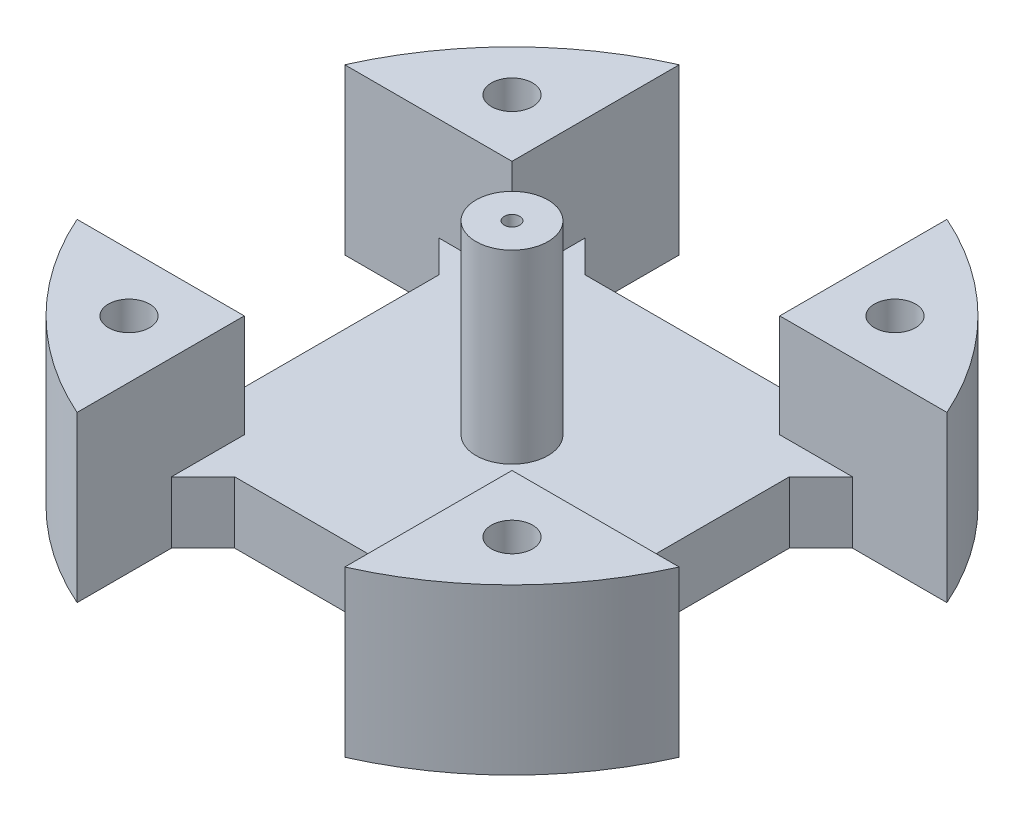
ISO-10303-21;
HEADER;
FILE_DESCRIPTION(('STEP AP214'),'2;1');
FILE_NAME('part.step','',(''),(''),'','','');
FILE_SCHEMA(('AUTOMOTIVE_DESIGN { 1 0 10303 214 1 1 1 1 }'));
ENDSEC;
DATA;
#1=APPLICATION_CONTEXT('core data for automotive mechanical design processes');
#2=APPLICATION_PROTOCOL_DEFINITION('international standard','automotive_design',2000,#1);
#3=PRODUCT_CONTEXT('',#1,'mechanical');
#4=PRODUCT('Part','Part','',(#3));
#5=PRODUCT_RELATED_PRODUCT_CATEGORY('part','',(#4));
#6=PRODUCT_DEFINITION_FORMATION('','',#4);
#7=PRODUCT_DEFINITION_CONTEXT('part definition',#1,'design');
#8=PRODUCT_DEFINITION('design','',#6,#7);
#9=PRODUCT_DEFINITION_SHAPE('','',#8);
#10=(LENGTH_UNIT() NAMED_UNIT(*) SI_UNIT(.MILLI.,.METRE.));
#11=(NAMED_UNIT(*) PLANE_ANGLE_UNIT() SI_UNIT($,.RADIAN.));
#12=(NAMED_UNIT(*) SI_UNIT($,.STERADIAN.) SOLID_ANGLE_UNIT());
#13=UNCERTAINTY_MEASURE_WITH_UNIT(LENGTH_MEASURE(1.E-05),#10,'distance_accuracy_value','');
#14=(GEOMETRIC_REPRESENTATION_CONTEXT(3) GLOBAL_UNCERTAINTY_ASSIGNED_CONTEXT((#13)) GLOBAL_UNIT_ASSIGNED_CONTEXT((#10,
#11,#12)) REPRESENTATION_CONTEXT('',''));
#15=CARTESIAN_POINT('',(0.,0.,0.));
#16=DIRECTION('',(0.,0.,1.));
#17=DIRECTION('',(1.,0.,0.));
#18=AXIS2_PLACEMENT_3D('',#15,#16,#17);
#19=CARTESIAN_POINT('',(0.,3.,0.));
#20=DIRECTION('',(0.,1.,0.));
#21=DIRECTION('',(0.,0.,1.));
#22=AXIS2_PLACEMENT_3D('',#19,#20,#21);
#23=PLANE('',#22);
#24=DIRECTION('',(0.707106781186536,0.,0.707106781186559));
#25=VECTOR('',#24,1.);
#26=CARTESIAN_POINT('',(-1.76776695296641,3.,1.76776695296635));
#27=LINE('',#26,#25);
#28=CARTESIAN_POINT('',(4.96446609406703,3.,8.5));
#29=VERTEX_POINT('',#28);
#30=CARTESIAN_POINT('',(6.5,3.,10.035533905933));
#31=VERTEX_POINT('',#30);
#32=EDGE_CURVE('E234',#29,#31,#27,.T.);
#33=ORIENTED_EDGE('',*,*,#32,.T.);
#34=DIRECTION('',(0.,0.,1.));
#35=VECTOR('',#34,1.);
#36=CARTESIAN_POINT('',(6.5,3.,6.5));
#37=LINE('',#36,#35);
#38=CARTESIAN_POINT('',(6.5,3.,6.5));
#39=VERTEX_POINT('',#38);
#40=EDGE_CURVE('E228',#39,#31,#37,.T.);
#41=ORIENTED_EDGE('',*,*,#40,.F.);
#42=DIRECTION('',(-1.,0.,0.));
#43=VECTOR('',#42,1.);
#44=CARTESIAN_POINT('',(20.9643029327709,3.,6.5));
#45=LINE('',#44,#43);
#46=CARTESIAN_POINT('',(10.0355339059329,3.,6.5));
#47=VERTEX_POINT('',#46);
#48=EDGE_CURVE('E220',#47,#39,#45,.T.);
#49=ORIENTED_EDGE('',*,*,#48,.F.);
#50=DIRECTION('',(-0.707106781186552,0.,-0.707106781186543));
#51=VECTOR('',#50,1.);
#52=CARTESIAN_POINT('',(1.76776695296641,3.,-1.76776695296644));
#53=LINE('',#52,#51);
#54=CARTESIAN_POINT('',(8.5,3.,4.96446609406707));
#55=VERTEX_POINT('',#54);
#56=EDGE_CURVE('E256',#47,#55,#53,.T.);
#57=ORIENTED_EDGE('',*,*,#56,.T.);
#58=DIRECTION('',(0.,0.,-1.));
#59=VECTOR('',#58,1.);
#60=CARTESIAN_POINT('',(8.5,3.,0.));
#61=LINE('',#60,#59);
#62=CARTESIAN_POINT('',(8.5,3.,-4.96446609406749));
#63=VERTEX_POINT('',#62);
#64=EDGE_CURVE('E258',#55,#63,#61,.T.);
#65=ORIENTED_EDGE('',*,*,#64,.T.);
#66=DIRECTION('',(0.707106781186535,0.,-0.70710678118656));
#67=VECTOR('',#66,1.);
#68=CARTESIAN_POINT('',(1.76776695296641,3.,1.76776695296635));
#69=LINE('',#68,#67);
#70=CARTESIAN_POINT('',(10.0355339059325,3.,-6.5));
#71=VERTEX_POINT('',#70);
#72=EDGE_CURVE('E260',#63,#71,#69,.T.);
#73=ORIENTED_EDGE('',*,*,#72,.T.);
#74=DIRECTION('',(1.,0.,0.));
#75=VECTOR('',#74,1.);
#76=CARTESIAN_POINT('',(6.5,3.,-6.5));
#77=LINE('',#76,#75);
#78=CARTESIAN_POINT('',(6.5,3.,-6.5));
#79=VERTEX_POINT('',#78);
#80=EDGE_CURVE('E458',#79,#71,#77,.T.);
#81=ORIENTED_EDGE('',*,*,#80,.F.);
#82=DIRECTION('',(0.,0.,1.));
#83=VECTOR('',#82,1.);
#84=CARTESIAN_POINT('',(6.5,3.,-17.2962218079363));
#85=LINE('',#84,#83);
#86=CARTESIAN_POINT('',(6.49999999999999,3.,-10.0355339059328));
#87=VERTEX_POINT('',#86);
#88=EDGE_CURVE('E50',#87,#79,#85,.T.);
#89=ORIENTED_EDGE('',*,*,#88,.F.);
#90=DIRECTION('',(0.707106781186552,0.,-0.707106781186543));
#91=VECTOR('',#90,1.);
#92=CARTESIAN_POINT('',(-1.76776695296642,3.,-1.76776695296645));
#93=LINE('',#92,#91);
#94=CARTESIAN_POINT('',(4.96446609406722,3.,-8.50000000000001));
#95=VERTEX_POINT('',#94);
#96=EDGE_CURVE('E11',#95,#87,#93,.T.);
#97=ORIENTED_EDGE('',*,*,#96,.F.);
#98=DIRECTION('',(1.,0.,0.));
#99=VECTOR('',#98,1.);
#100=CARTESIAN_POINT('',(0.,3.,-8.50000000000001));
#101=LINE('',#100,#99);
#102=CARTESIAN_POINT('',(-4.96446609406726,3.,-8.50000000000001));
#103=VERTEX_POINT('',#102);
#104=EDGE_CURVE('E243',#103,#95,#101,.T.);
#105=ORIENTED_EDGE('',*,*,#104,.F.);
#106=DIRECTION('',(0.707106781186547,0.,0.707106781186548));
#107=VECTOR('',#106,1.);
#108=CARTESIAN_POINT('',(1.76776695296637,3.,-1.76776695296636));
#109=LINE('',#108,#107);
#110=CARTESIAN_POINT('',(-6.5,3.,-10.0355339059327));
#111=VERTEX_POINT('',#110);
#112=EDGE_CURVE('E247',#111,#103,#109,.T.);
#113=ORIENTED_EDGE('',*,*,#112,.F.);
#114=DIRECTION('',(0.,0.,-1.));
#115=VECTOR('',#114,1.);
#116=CARTESIAN_POINT('',(-6.5,3.,-6.5));
#117=LINE('',#116,#115);
#118=CARTESIAN_POINT('',(-6.5,3.,-6.5));
#119=VERTEX_POINT('',#118);
#120=EDGE_CURVE('E454',#119,#111,#117,.T.);
#121=ORIENTED_EDGE('',*,*,#120,.F.);
#122=DIRECTION('',(1.,0.,0.));
#123=VECTOR('',#122,1.);
#124=CARTESIAN_POINT('',(-19.320760019923,3.,-6.5));
#125=LINE('',#124,#123);
#126=CARTESIAN_POINT('',(-10.0355339059325,3.,-6.5));
#127=VERTEX_POINT('',#126);
#128=EDGE_CURVE('E452',#127,#119,#125,.T.);
#129=ORIENTED_EDGE('',*,*,#128,.F.);
#130=DIRECTION('',(-0.707106781186535,0.,-0.70710678118656));
#131=VECTOR('',#130,1.);
#132=CARTESIAN_POINT('',(-1.76776695296641,3.,1.76776695296635));
#133=LINE('',#132,#131);
#134=CARTESIAN_POINT('',(-8.5,3.,-4.96446609406749));
#135=VERTEX_POINT('',#134);
#136=EDGE_CURVE('E262',#135,#127,#133,.T.);
#137=ORIENTED_EDGE('',*,*,#136,.F.);
#138=DIRECTION('',(0.,0.,-1.));
#139=VECTOR('',#138,1.);
#140=CARTESIAN_POINT('',(-8.5,3.,0.));
#141=LINE('',#140,#139);
#142=CARTESIAN_POINT('',(-8.5,3.,4.96446609406707));
#143=VERTEX_POINT('',#142);
#144=EDGE_CURVE('E265',#143,#135,#141,.T.);
#145=ORIENTED_EDGE('',*,*,#144,.F.);
#146=DIRECTION('',(0.707106781186551,0.,-0.707106781186545));
#147=VECTOR('',#146,1.);
#148=CARTESIAN_POINT('',(-1.76776695296643,3.,-1.76776695296645));
#149=LINE('',#148,#147);
#150=CARTESIAN_POINT('',(-10.0355339059329,3.,6.5));
#151=VERTEX_POINT('',#150);
#152=EDGE_CURVE('E268',#151,#143,#149,.T.);
#153=ORIENTED_EDGE('',*,*,#152,.F.);
#154=DIRECTION('',(-1.,0.,0.));
#155=VECTOR('',#154,1.);
#156=CARTESIAN_POINT('',(-6.5,3.,6.5));
#157=LINE('',#156,#155);
#158=CARTESIAN_POINT('',(-6.5,3.,6.5));
#159=VERTEX_POINT('',#158);
#160=EDGE_CURVE('E449',#159,#151,#157,.T.);
#161=ORIENTED_EDGE('',*,*,#160,.F.);
#162=DIRECTION('',(0.,0.,-1.));
#163=VECTOR('',#162,1.);
#164=CARTESIAN_POINT('',(-6.5,3.,16.5994319382506));
#165=LINE('',#164,#163);
#166=CARTESIAN_POINT('',(-6.5,3.,10.0355339059328));
#167=VERTEX_POINT('',#166);
#168=EDGE_CURVE('E237',#167,#159,#165,.T.);
#169=ORIENTED_EDGE('',*,*,#168,.F.);
#170=DIRECTION('',(0.707106781186551,0.,-0.707106781186544));
#171=VECTOR('',#170,1.);
#172=CARTESIAN_POINT('',(1.76776695296642,3.,1.76776695296644));
#173=LINE('',#172,#171);
#174=CARTESIAN_POINT('',(-4.96446609406722,3.,8.5));
#175=VERTEX_POINT('',#174);
#176=EDGE_CURVE('E271',#167,#175,#173,.T.);
#177=ORIENTED_EDGE('',*,*,#176,.T.);
#178=DIRECTION('',(1.,0.,0.));
#179=VECTOR('',#178,1.);
#180=CARTESIAN_POINT('',(0.,3.,8.5));
#181=LINE('',#180,#179);
#182=EDGE_CURVE('E273',#175,#29,#181,.T.);
#183=ORIENTED_EDGE('',*,*,#182,.T.);
#184=EDGE_LOOP('',(#33,#41,#49,#57,#65,#73,#81,#89,#97,#105,#113,#121,#129,#137,#145,#153,#161,
#169,#177,#183));
#185=FACE_BOUND('',#184,.T.);
#186=CARTESIAN_POINT('',(0.,3.,0.));
#187=DIRECTION('',(0.,1.,0.));
#188=DIRECTION('',(0.,0.,1.));
#189=AXIS2_PLACEMENT_3D('',#186,#187,#188);
#190=CIRCLE('',#189,1.75);
#191=CARTESIAN_POINT('',(0.,3.,1.75));
#192=VERTEX_POINT('',#191);
#193=EDGE_CURVE('E414',#192,#192,#190,.T.);
#194=ORIENTED_EDGE('',*,*,#193,.F.);
#195=EDGE_LOOP('',(#194));
#196=FACE_BOUND('',#195,.T.);
#197=ADVANCED_FACE('F33',(#185,#196),#23,.T.);
#198=CARTESIAN_POINT('',(0.,8.,0.));
#199=DIRECTION('',(0.,1.,0.));
#200=DIRECTION('',(0.,0.,1.));
#201=AXIS2_PLACEMENT_3D('',#198,#199,#200);
#202=PLANE('',#201);
#203=CARTESIAN_POINT('',(9.298454172603,8.,9.2984541726032));
#204=DIRECTION('',(0.,1.,0.));
#205=DIRECTION('',(0.,0.,1.));
#206=AXIS2_PLACEMENT_3D('',#203,#204,#205);
#207=CIRCLE('',#206,1.);
#208=CARTESIAN_POINT('',(9.298454172603,8.,10.2984541726032));
#209=VERTEX_POINT('',#208);
#210=EDGE_CURVE('E422',#209,#209,#207,.T.);
#211=ORIENTED_EDGE('',*,*,#210,.F.);
#212=EDGE_LOOP('',(#211));
#213=FACE_BOUND('',#212,.T.);
#214=DIRECTION('',(1.,0.,0.));
#215=VECTOR('',#214,1.);
#216=CARTESIAN_POINT('',(0.,8.,6.5));
#217=LINE('',#216,#215);
#218=CARTESIAN_POINT('',(6.5,8.,6.5));
#219=VERTEX_POINT('',#218);
#220=CARTESIAN_POINT('',(14.6201915172134,8.,6.5));
#221=VERTEX_POINT('',#220);
#222=EDGE_CURVE('E325',#219,#221,#217,.T.);
#223=ORIENTED_EDGE('',*,*,#222,.F.);
#224=DIRECTION('',(0.,0.,-1.));
#225=VECTOR('',#224,1.);
#226=CARTESIAN_POINT('',(6.5,8.,0.));
#227=LINE('',#226,#225);
#228=CARTESIAN_POINT('',(6.5,8.,14.6201915172134));
#229=VERTEX_POINT('',#228);
#230=EDGE_CURVE('E241',#229,#219,#227,.T.);
#231=ORIENTED_EDGE('',*,*,#230,.F.);
#232=CARTESIAN_POINT('',(0.,8.,0.));
#233=DIRECTION('',(0.,1.,0.));
#234=DIRECTION('',(0.,0.,1.));
#235=AXIS2_PLACEMENT_3D('',#232,#233,#234);
#236=CIRCLE('',#235,16.);
#237=EDGE_CURVE('E42',#229,#221,#236,.T.);
#238=ORIENTED_EDGE('',*,*,#237,.T.);
#239=EDGE_LOOP('',(#223,#231,#238));
#240=FACE_BOUND('',#239,.T.);
#241=ADVANCED_FACE('F531',(#213,#240),#202,.T.);
#242=CARTESIAN_POINT('',(-9.2984541726031,8.,9.2984541726031));
#243=DIRECTION('',(0.,1.,0.));
#244=DIRECTION('',(0.,0.,1.));
#245=AXIS2_PLACEMENT_3D('',#242,#243,#244);
#246=CIRCLE('',#245,1.);
#247=CARTESIAN_POINT('',(-9.2984541726031,8.,10.2984541726031));
#248=VERTEX_POINT('',#247);
#249=EDGE_CURVE('E425',#248,#248,#246,.T.);
#250=ORIENTED_EDGE('',*,*,#249,.F.);
#251=EDGE_LOOP('',(#250));
#252=FACE_BOUND('',#251,.T.);
#253=DIRECTION('',(0.,0.,1.));
#254=VECTOR('',#253,1.);
#255=CARTESIAN_POINT('',(-6.5,8.,0.));
#256=LINE('',#255,#254);
#257=CARTESIAN_POINT('',(-6.5,8.,6.5));
#258=VERTEX_POINT('',#257);
#259=CARTESIAN_POINT('',(-6.5,8.,14.6201915172134));
#260=VERTEX_POINT('',#259);
#261=EDGE_CURVE('E397',#258,#260,#256,.T.);
#262=ORIENTED_EDGE('',*,*,#261,.F.);
#263=DIRECTION('',(-1.,0.,0.));
#264=VECTOR('',#263,1.);
#265=CARTESIAN_POINT('',(0.,8.,6.50000000000001));
#266=LINE('',#265,#264);
#267=CARTESIAN_POINT('',(-14.6201915172134,8.,6.5));
#268=VERTEX_POINT('',#267);
#269=EDGE_CURVE('E355',#258,#268,#266,.T.);
#270=ORIENTED_EDGE('',*,*,#269,.T.);
#271=EDGE_CURVE('E405',#268,#260,#236,.T.);
#272=ORIENTED_EDGE('',*,*,#271,.T.);
#273=EDGE_LOOP('',(#262,#270,#272));
#274=FACE_BOUND('',#273,.T.);
#275=ADVANCED_FACE('F496',(#252,#274),#202,.T.);
#276=CARTESIAN_POINT('',(-9.29845417260311,8.,-9.2984541726031));
#277=DIRECTION('',(0.,1.,0.));
#278=DIRECTION('',(0.,0.,1.));
#279=AXIS2_PLACEMENT_3D('',#276,#277,#278);
#280=CIRCLE('',#279,0.999999999999982);
#281=CARTESIAN_POINT('',(-9.29845417260311,8.,-8.29845417260312));
#282=VERTEX_POINT('',#281);
#283=EDGE_CURVE('E415',#282,#282,#280,.T.);
#284=ORIENTED_EDGE('',*,*,#283,.F.);
#285=EDGE_LOOP('',(#284));
#286=FACE_BOUND('',#285,.T.);
#287=DIRECTION('',(1.,0.,0.));
#288=VECTOR('',#287,1.);
#289=CARTESIAN_POINT('',(0.,8.,-6.5));
#290=LINE('',#289,#288);
#291=CARTESIAN_POINT('',(-14.6201915172134,8.,-6.5));
#292=VERTEX_POINT('',#291);
#293=CARTESIAN_POINT('',(-6.5,8.,-6.5));
#294=VERTEX_POINT('',#293);
#295=EDGE_CURVE('E367',#292,#294,#290,.T.);
#296=ORIENTED_EDGE('',*,*,#295,.T.);
#297=DIRECTION('',(0.,0.,-1.));
#298=VECTOR('',#297,1.);
#299=CARTESIAN_POINT('',(-6.5,8.,0.));
#300=LINE('',#299,#298);
#301=CARTESIAN_POINT('',(-6.5,8.,-14.6201915172134));
#302=VERTEX_POINT('',#301);
#303=EDGE_CURVE('E293',#294,#302,#300,.T.);
#304=ORIENTED_EDGE('',*,*,#303,.T.);
#305=EDGE_CURVE('E404',#302,#292,#236,.T.);
#306=ORIENTED_EDGE('',*,*,#305,.T.);
#307=EDGE_LOOP('',(#296,#304,#306));
#308=FACE_BOUND('',#307,.T.);
#309=ADVANCED_FACE('F491',(#286,#308),#202,.T.);
#310=CARTESIAN_POINT('',(9.29845417260316,8.,-9.29845417260304));
#311=DIRECTION('',(0.,1.,0.));
#312=DIRECTION('',(0.,0.,1.));
#313=AXIS2_PLACEMENT_3D('',#310,#311,#312);
#314=CIRCLE('',#313,1.);
#315=CARTESIAN_POINT('',(9.29845417260316,8.,-8.29845417260304));
#316=VERTEX_POINT('',#315);
#317=EDGE_CURVE('E419',#316,#316,#314,.T.);
#318=ORIENTED_EDGE('',*,*,#317,.F.);
#319=EDGE_LOOP('',(#318));
#320=FACE_BOUND('',#319,.T.);
#321=DIRECTION('',(0.,0.,1.));
#322=VECTOR('',#321,1.);
#323=CARTESIAN_POINT('',(6.49999999999999,8.,0.));
#324=LINE('',#323,#322);
#325=CARTESIAN_POINT('',(6.5,8.,-14.6201915172134));
#326=VERTEX_POINT('',#325);
#327=CARTESIAN_POINT('',(6.5,8.,-6.5));
#328=VERTEX_POINT('',#327);
#329=EDGE_CURVE('E305',#326,#328,#324,.T.);
#330=ORIENTED_EDGE('',*,*,#329,.T.);
#331=DIRECTION('',(-1.,0.,0.));
#332=VECTOR('',#331,1.);
#333=CARTESIAN_POINT('',(0.,8.,-6.5));
#334=LINE('',#333,#332);
#335=CARTESIAN_POINT('',(14.6201915172134,8.,-6.5));
#336=VERTEX_POINT('',#335);
#337=EDGE_CURVE('E335',#336,#328,#334,.T.);
#338=ORIENTED_EDGE('',*,*,#337,.F.);
#339=EDGE_CURVE('E403',#336,#326,#236,.T.);
#340=ORIENTED_EDGE('',*,*,#339,.T.);
#341=EDGE_LOOP('',(#330,#338,#340));
#342=FACE_BOUND('',#341,.T.);
#343=ADVANCED_FACE('F573',(#320,#342),#202,.T.);
#344=CARTESIAN_POINT('',(-1.76776695296641,10.,1.76776695296635));
#345=DIRECTION('',(0.707106781186559,0.,-0.707106781186536));
#346=DIRECTION('',(-0.707106781186536,0.,-0.707106781186559));
#347=AXIS2_PLACEMENT_3D('',#344,#345,#346);
#348=PLANE('',#347);
#349=ORIENTED_EDGE('',*,*,#32,.F.);
#350=DIRECTION('',(0.,-1.,0.));
#351=VECTOR('',#350,1.);
#352=CARTESIAN_POINT('',(4.96446609406703,10.,8.5));
#353=LINE('',#352,#351);
#354=CARTESIAN_POINT('',(4.96446609406703,0.,8.5));
#355=VERTEX_POINT('',#354);
#356=EDGE_CURVE('E385',#29,#355,#353,.T.);
#357=ORIENTED_EDGE('',*,*,#356,.T.);
#358=DIRECTION('',(0.707106781186536,0.,0.707106781186559));
#359=VECTOR('',#358,1.);
#360=CARTESIAN_POINT('',(-1.76776695296641,0.,1.76776695296635));
#361=LINE('',#360,#359);
#362=CARTESIAN_POINT('',(6.5,0.,10.035533905933));
#363=VERTEX_POINT('',#362);
#364=EDGE_CURVE('E369',#355,#363,#361,.T.);
#365=ORIENTED_EDGE('',*,*,#364,.T.);
#366=DIRECTION('',(0.,-1.,0.));
#367=VECTOR('',#366,1.);
#368=CARTESIAN_POINT('',(6.5,10.,10.035533905933));
#369=LINE('',#368,#367);
#370=EDGE_CURVE('E384',#31,#363,#369,.T.);
#371=ORIENTED_EDGE('',*,*,#370,.F.);
#372=EDGE_LOOP('',(#349,#357,#365,#371));
#373=FACE_BOUND('',#372,.T.);
#374=ADVANCED_FACE('F522',(#373),#348,.F.);
#375=CARTESIAN_POINT('',(0.,10.,8.5));
#376=DIRECTION('',(0.,0.,-1.));
#377=DIRECTION('',(-1.,0.,0.));
#378=AXIS2_PLACEMENT_3D('',#375,#376,#377);
#379=PLANE('',#378);
#380=ORIENTED_EDGE('',*,*,#182,.F.);
#381=DIRECTION('',(0.,-1.,0.));
#382=VECTOR('',#381,1.);
#383=CARTESIAN_POINT('',(-4.96446609406722,10.,8.5));
#384=LINE('',#383,#382);
#385=CARTESIAN_POINT('',(-4.96446609406722,0.,8.5));
#386=VERTEX_POINT('',#385);
#387=EDGE_CURVE('E387',#175,#386,#384,.T.);
#388=ORIENTED_EDGE('',*,*,#387,.T.);
#389=DIRECTION('',(1.,0.,0.));
#390=VECTOR('',#389,1.);
#391=CARTESIAN_POINT('',(0.,0.,8.5));
#392=LINE('',#391,#390);
#393=EDGE_CURVE('E381',#386,#355,#392,.T.);
#394=ORIENTED_EDGE('',*,*,#393,.T.);
#395=ORIENTED_EDGE('',*,*,#356,.F.);
#396=EDGE_LOOP('',(#380,#388,#394,#395));
#397=FACE_BOUND('',#396,.T.);
#398=ADVANCED_FACE('F519',(#397),#379,.F.);
#399=CARTESIAN_POINT('',(1.76776695296642,10.,1.76776695296644));
#400=DIRECTION('',(-0.707106781186544,0.,-0.707106781186551));
#401=DIRECTION('',(-0.707106781186551,0.,0.707106781186544));
#402=AXIS2_PLACEMENT_3D('',#399,#400,#401);
#403=PLANE('',#402);
#404=ORIENTED_EDGE('',*,*,#176,.F.);
#405=DIRECTION('',(0.,-1.,0.));
#406=VECTOR('',#405,1.);
#407=CARTESIAN_POINT('',(-6.5,10.,10.0355339059328));
#408=LINE('',#407,#406);
#409=CARTESIAN_POINT('',(-6.5,0.,10.0355339059328));
#410=VERTEX_POINT('',#409);
#411=EDGE_CURVE('E389',#167,#410,#408,.T.);
#412=ORIENTED_EDGE('',*,*,#411,.T.);
#413=DIRECTION('',(0.707106781186551,0.,-0.707106781186544));
#414=VECTOR('',#413,1.);
#415=CARTESIAN_POINT('',(1.76776695296642,0.,1.76776695296644));
#416=LINE('',#415,#414);
#417=EDGE_CURVE('E378',#410,#386,#416,.T.);
#418=ORIENTED_EDGE('',*,*,#417,.T.);
#419=ORIENTED_EDGE('',*,*,#387,.F.);
#420=EDGE_LOOP('',(#404,#412,#418,#419));
#421=FACE_BOUND('',#420,.T.);
#422=ADVANCED_FACE('F513',(#421),#403,.F.);
#423=CARTESIAN_POINT('',(-1.76776695296643,10.,-1.76776695296645));
#424=DIRECTION('',(-0.707106781186545,0.,-0.707106781186551));
#425=DIRECTION('',(-0.707106781186551,0.,0.707106781186545));
#426=AXIS2_PLACEMENT_3D('',#423,#424,#425);
#427=PLANE('',#426);
#428=DIRECTION('',(0.,-1.,0.));
#429=VECTOR('',#428,1.);
#430=CARTESIAN_POINT('',(-10.0355339059329,10.,6.5));
#431=LINE('',#430,#429);
#432=CARTESIAN_POINT('',(-10.0355339059329,0.,6.5));
#433=VERTEX_POINT('',#432);
#434=EDGE_CURVE('E358',#151,#433,#431,.T.);
#435=ORIENTED_EDGE('',*,*,#434,.F.);
#436=ORIENTED_EDGE('',*,*,#152,.T.);
#437=DIRECTION('',(0.,-1.,0.));
#438=VECTOR('',#437,1.);
#439=CARTESIAN_POINT('',(-8.5,10.,4.96446609406707));
#440=LINE('',#439,#438);
#441=CARTESIAN_POINT('',(-8.5,0.,4.96446609406707));
#442=VERTEX_POINT('',#441);
#443=EDGE_CURVE('E360',#143,#442,#440,.T.);
#444=ORIENTED_EDGE('',*,*,#443,.T.);
#445=DIRECTION('',(0.707106781186551,0.,-0.707106781186545));
#446=VECTOR('',#445,1.);
#447=CARTESIAN_POINT('',(-1.76776695296643,0.,-1.76776695296645));
#448=LINE('',#447,#446);
#449=EDGE_CURVE('E346',#433,#442,#448,.T.);
#450=ORIENTED_EDGE('',*,*,#449,.F.);
#451=EDGE_LOOP('',(#435,#436,#444,#450));
#452=FACE_BOUND('',#451,.T.);
#453=ADVANCED_FACE('F597',(#452),#427,.T.);
#454=CARTESIAN_POINT('',(-8.5,10.,0.));
#455=DIRECTION('',(-1.,0.,0.));
#456=DIRECTION('',(0.,0.,1.));
#457=AXIS2_PLACEMENT_3D('',#454,#455,#456);
#458=PLANE('',#457);
#459=ORIENTED_EDGE('',*,*,#443,.F.);
#460=ORIENTED_EDGE('',*,*,#144,.T.);
#461=DIRECTION('',(0.,-1.,0.));
#462=VECTOR('',#461,1.);
#463=CARTESIAN_POINT('',(-8.5,10.,-4.96446609406749));
#464=LINE('',#463,#462);
#465=CARTESIAN_POINT('',(-8.5,0.,-4.96446609406749));
#466=VERTEX_POINT('',#465);
#467=EDGE_CURVE('E362',#135,#466,#464,.T.);
#468=ORIENTED_EDGE('',*,*,#467,.T.);
#469=DIRECTION('',(0.,0.,-1.));
#470=VECTOR('',#469,1.);
#471=CARTESIAN_POINT('',(-8.5,0.,0.));
#472=LINE('',#471,#470);
#473=EDGE_CURVE('E343',#442,#466,#472,.T.);
#474=ORIENTED_EDGE('',*,*,#473,.F.);
#475=EDGE_LOOP('',(#459,#460,#468,#474));
#476=FACE_BOUND('',#475,.T.);
#477=ADVANCED_FACE('F600',(#476),#458,.T.);
#478=CARTESIAN_POINT('',(-1.76776695296641,10.,1.76776695296635));
#479=DIRECTION('',(-0.70710678118656,0.,0.707106781186535));
#480=DIRECTION('',(0.707106781186535,0.,0.70710678118656));
#481=AXIS2_PLACEMENT_3D('',#478,#479,#480);
#482=PLANE('',#481);
#483=ORIENTED_EDGE('',*,*,#467,.F.);
#484=ORIENTED_EDGE('',*,*,#136,.T.);
#485=DIRECTION('',(0.,-1.,0.));
#486=VECTOR('',#485,1.);
#487=CARTESIAN_POINT('',(-10.0355339059325,10.,-6.5));
#488=LINE('',#487,#486);
#489=CARTESIAN_POINT('',(-10.0355339059325,0.,-6.5));
#490=VERTEX_POINT('',#489);
#491=EDGE_CURVE('E352',#127,#490,#488,.T.);
#492=ORIENTED_EDGE('',*,*,#491,.T.);
#493=DIRECTION('',(-0.707106781186535,0.,-0.70710678118656));
#494=VECTOR('',#493,1.);
#495=CARTESIAN_POINT('',(-1.76776695296641,0.,1.76776695296635));
#496=LINE('',#495,#494);
#497=EDGE_CURVE('E340',#466,#490,#496,.T.);
#498=ORIENTED_EDGE('',*,*,#497,.F.);
#499=EDGE_LOOP('',(#483,#484,#492,#498));
#500=FACE_BOUND('',#499,.T.);
#501=ADVANCED_FACE('F604',(#500),#482,.T.);
#502=CARTESIAN_POINT('',(1.76776695296641,10.,1.76776695296635));
#503=DIRECTION('',(-0.70710678118656,0.,-0.707106781186535));
#504=DIRECTION('',(-0.707106781186535,0.,0.70710678118656));
#505=AXIS2_PLACEMENT_3D('',#502,#503,#504);
#506=PLANE('',#505);
#507=ORIENTED_EDGE('',*,*,#72,.F.);
#508=DIRECTION('',(0.,-1.,0.));
#509=VECTOR('',#508,1.);
#510=CARTESIAN_POINT('',(8.5,10.,-4.96446609406749));
#511=LINE('',#510,#509);
#512=CARTESIAN_POINT('',(8.5,0.,-4.96446609406749));
#513=VERTEX_POINT('',#512);
#514=EDGE_CURVE('E328',#63,#513,#511,.T.);
#515=ORIENTED_EDGE('',*,*,#514,.T.);
#516=DIRECTION('',(0.707106781186535,0.,-0.70710678118656));
#517=VECTOR('',#516,1.);
#518=CARTESIAN_POINT('',(1.76776695296641,0.,1.76776695296635));
#519=LINE('',#518,#517);
#520=CARTESIAN_POINT('',(10.0355339059325,0.,-6.5));
#521=VERTEX_POINT('',#520);
#522=EDGE_CURVE('E316',#513,#521,#519,.T.);
#523=ORIENTED_EDGE('',*,*,#522,.T.);
#524=DIRECTION('',(0.,-1.,0.));
#525=VECTOR('',#524,1.);
#526=CARTESIAN_POINT('',(10.0355339059325,10.,-6.5));
#527=LINE('',#526,#525);
#528=EDGE_CURVE('E326',#71,#521,#527,.T.);
#529=ORIENTED_EDGE('',*,*,#528,.F.);
#530=EDGE_LOOP('',(#507,#515,#523,#529));
#531=FACE_BOUND('',#530,.T.);
#532=ADVANCED_FACE('F543',(#531),#506,.F.);
#533=CARTESIAN_POINT('',(8.5,10.,0.));
#534=DIRECTION('',(-1.,0.,0.));
#535=DIRECTION('',(0.,0.,1.));
#536=AXIS2_PLACEMENT_3D('',#533,#534,#535);
#537=PLANE('',#536);
#538=ORIENTED_EDGE('',*,*,#64,.F.);
#539=DIRECTION('',(0.,-1.,0.));
#540=VECTOR('',#539,1.);
#541=CARTESIAN_POINT('',(8.5,10.,4.96446609406707));
#542=LINE('',#541,#540);
#543=CARTESIAN_POINT('',(8.5,0.,4.96446609406707));
#544=VERTEX_POINT('',#543);
#545=EDGE_CURVE('E330',#55,#544,#542,.T.);
#546=ORIENTED_EDGE('',*,*,#545,.T.);
#547=DIRECTION('',(0.,0.,-1.));
#548=VECTOR('',#547,1.);
#549=CARTESIAN_POINT('',(8.5,0.,0.));
#550=LINE('',#549,#548);
#551=EDGE_CURVE('E313',#544,#513,#550,.T.);
#552=ORIENTED_EDGE('',*,*,#551,.T.);
#553=ORIENTED_EDGE('',*,*,#514,.F.);
#554=EDGE_LOOP('',(#538,#546,#552,#553));
#555=FACE_BOUND('',#554,.T.);
#556=ADVANCED_FACE('F541',(#555),#537,.F.);
#557=CARTESIAN_POINT('',(1.76776695296641,10.,-1.76776695296644));
#558=DIRECTION('',(-0.707106781186543,0.,0.707106781186552));
#559=DIRECTION('',(0.707106781186552,0.,0.707106781186543));
#560=AXIS2_PLACEMENT_3D('',#557,#558,#559);
#561=PLANE('',#560);
#562=ORIENTED_EDGE('',*,*,#56,.F.);
#563=DIRECTION('',(0.,-1.,0.));
#564=VECTOR('',#563,1.);
#565=CARTESIAN_POINT('',(10.0355339059329,10.,6.5));
#566=LINE('',#565,#564);
#567=CARTESIAN_POINT('',(10.0355339059329,0.,6.5));
#568=VERTEX_POINT('',#567);
#569=EDGE_CURVE('E226',#47,#568,#566,.T.);
#570=ORIENTED_EDGE('',*,*,#569,.T.);
#571=DIRECTION('',(-0.707106781186552,0.,-0.707106781186543));
#572=VECTOR('',#571,1.);
#573=CARTESIAN_POINT('',(1.76776695296641,0.,-1.76776695296644));
#574=LINE('',#573,#572);
#575=EDGE_CURVE('E310',#568,#544,#574,.T.);
#576=ORIENTED_EDGE('',*,*,#575,.T.);
#577=ORIENTED_EDGE('',*,*,#545,.F.);
#578=EDGE_LOOP('',(#562,#570,#576,#577));
#579=FACE_BOUND('',#578,.T.);
#580=ADVANCED_FACE('F536',(#579),#561,.F.);
#581=CARTESIAN_POINT('',(1.76776695296637,10.,-1.76776695296636));
#582=DIRECTION('',(0.707106781186548,0.,-0.707106781186547));
#583=DIRECTION('',(-0.707106781186547,0.,-0.707106781186548));
#584=AXIS2_PLACEMENT_3D('',#581,#582,#583);
#585=PLANE('',#584);
#586=DIRECTION('',(0.,-1.,0.));
#587=VECTOR('',#586,1.);
#588=CARTESIAN_POINT('',(-6.5,10.,-10.0355339059327));
#589=LINE('',#588,#587);
#590=CARTESIAN_POINT('',(-6.5,0.,-10.0355339059327));
#591=VERTEX_POINT('',#590);
#592=EDGE_CURVE('E296',#111,#591,#589,.T.);
#593=ORIENTED_EDGE('',*,*,#592,.F.);
#594=ORIENTED_EDGE('',*,*,#112,.T.);
#595=DIRECTION('',(0.,-1.,0.));
#596=VECTOR('',#595,1.);
#597=CARTESIAN_POINT('',(-4.96446609406726,10.,-8.50000000000001));
#598=LINE('',#597,#596);
#599=CARTESIAN_POINT('',(-4.96446609406726,0.,-8.50000000000001));
#600=VERTEX_POINT('',#599);
#601=EDGE_CURVE('E298',#103,#600,#598,.T.);
#602=ORIENTED_EDGE('',*,*,#601,.T.);
#603=DIRECTION('',(0.707106781186547,0.,0.707106781186548));
#604=VECTOR('',#603,1.);
#605=CARTESIAN_POINT('',(1.76776695296637,0.,-1.76776695296636));
#606=LINE('',#605,#604);
#607=EDGE_CURVE('E285',#591,#600,#606,.T.);
#608=ORIENTED_EDGE('',*,*,#607,.F.);
#609=EDGE_LOOP('',(#593,#594,#602,#608));
#610=FACE_BOUND('',#609,.T.);
#611=ADVANCED_FACE('F477',(#610),#585,.T.);
#612=CARTESIAN_POINT('',(0.,10.,-8.50000000000001));
#613=DIRECTION('',(0.,0.,-1.));
#614=DIRECTION('',(-1.,0.,0.));
#615=AXIS2_PLACEMENT_3D('',#612,#613,#614);
#616=PLANE('',#615);
#617=ORIENTED_EDGE('',*,*,#601,.F.);
#618=ORIENTED_EDGE('',*,*,#104,.T.);
#619=DIRECTION('',(0.,-1.,0.));
#620=VECTOR('',#619,1.);
#621=CARTESIAN_POINT('',(4.96446609406722,10.,-8.5));
#622=LINE('',#621,#620);
#623=CARTESIAN_POINT('',(4.96446609406722,0.,-8.5));
#624=VERTEX_POINT('',#623);
#625=EDGE_CURVE('E300',#95,#624,#622,.T.);
#626=ORIENTED_EDGE('',*,*,#625,.T.);
#627=DIRECTION('',(1.,0.,0.));
#628=VECTOR('',#627,1.);
#629=CARTESIAN_POINT('',(0.,0.,-8.50000000000001));
#630=LINE('',#629,#628);
#631=EDGE_CURVE('E282',#600,#624,#630,.T.);
#632=ORIENTED_EDGE('',*,*,#631,.F.);
#633=EDGE_LOOP('',(#617,#618,#626,#632));
#634=FACE_BOUND('',#633,.T.);
#635=ADVANCED_FACE('F481',(#634),#616,.T.);
#636=CARTESIAN_POINT('',(-1.76776695296642,10.,-1.76776695296645));
#637=DIRECTION('',(-0.707106781186543,0.,-0.707106781186552));
#638=DIRECTION('',(-0.707106781186552,0.,0.707106781186543));
#639=AXIS2_PLACEMENT_3D('',#636,#637,#638);
#640=PLANE('',#639);
#641=ORIENTED_EDGE('',*,*,#625,.F.);
#642=ORIENTED_EDGE('',*,*,#96,.T.);
#643=DIRECTION('',(0.,-1.,0.));
#644=VECTOR('',#643,1.);
#645=CARTESIAN_POINT('',(6.49999999999999,10.,-10.0355339059328));
#646=LINE('',#645,#644);
#647=CARTESIAN_POINT('',(6.49999999999999,0.,-10.0355339059328));
#648=VERTEX_POINT('',#647);
#649=EDGE_CURVE('E56',#87,#648,#646,.T.);
#650=ORIENTED_EDGE('',*,*,#649,.T.);
#651=DIRECTION('',(0.707106781186552,0.,-0.707106781186543));
#652=VECTOR('',#651,1.);
#653=CARTESIAN_POINT('',(-1.76776695296642,0.,-1.76776695296645));
#654=LINE('',#653,#652);
#655=EDGE_CURVE('E279',#624,#648,#654,.T.);
#656=ORIENTED_EDGE('',*,*,#655,.F.);
#657=EDGE_LOOP('',(#641,#642,#650,#656));
#658=FACE_BOUND('',#657,.T.);
#659=ADVANCED_FACE('F555',(#658),#640,.T.);
#660=CARTESIAN_POINT('',(0.,8.,0.));
#661=DIRECTION('',(0.,-1.,0.));
#662=DIRECTION('',(0.,0.,-1.));
#663=AXIS2_PLACEMENT_3D('',#660,#661,#662);
#664=CYLINDRICAL_SURFACE('',#663,16.);
#665=DIRECTION('',(0.,-1.,0.));
#666=VECTOR('',#665,1.);
#667=CARTESIAN_POINT('',(6.5,10.,-14.6201915172134));
#668=LINE('',#667,#666);
#669=CARTESIAN_POINT('',(6.5,0.,-14.6201915172134));
#670=VERTEX_POINT('',#669);
#671=EDGE_CURVE('E291',#326,#670,#668,.T.);
#672=ORIENTED_EDGE('',*,*,#671,.F.);
#673=ORIENTED_EDGE('',*,*,#339,.F.);
#674=DIRECTION('',(0.,-1.,0.));
#675=VECTOR('',#674,1.);
#676=CARTESIAN_POINT('',(14.6201915172134,10.,-6.5));
#677=LINE('',#676,#675);
#678=CARTESIAN_POINT('',(14.6201915172134,0.,-6.5));
#679=VERTEX_POINT('',#678);
#680=EDGE_CURVE('E323',#336,#679,#677,.T.);
#681=ORIENTED_EDGE('',*,*,#680,.T.);
#682=CARTESIAN_POINT('',(0.,0.,0.));
#683=DIRECTION('',(0.,1.,0.));
#684=DIRECTION('',(0.,0.,1.));
#685=AXIS2_PLACEMENT_3D('',#682,#683,#684);
#686=CIRCLE('',#685,16.);
#687=EDGE_CURVE('E408',#679,#670,#686,.T.);
#688=ORIENTED_EDGE('',*,*,#687,.T.);
#689=EDGE_LOOP('',(#672,#673,#681,#688));
#690=FACE_BOUND('',#689,.T.);
#691=ADVANCED_FACE('F557',(#690),#664,.T.);
#692=DIRECTION('',(0.,-1.,0.));
#693=VECTOR('',#692,1.);
#694=CARTESIAN_POINT('',(-6.5,10.,-14.6201915172134));
#695=LINE('',#694,#693);
#696=CARTESIAN_POINT('',(-6.5,0.,-14.6201915172134));
#697=VERTEX_POINT('',#696);
#698=EDGE_CURVE('E294',#302,#697,#695,.T.);
#699=ORIENTED_EDGE('',*,*,#698,.T.);
#700=CARTESIAN_POINT('',(-14.6201915172134,0.,-6.5));
#701=VERTEX_POINT('',#700);
#702=EDGE_CURVE('E409',#697,#701,#686,.T.);
#703=ORIENTED_EDGE('',*,*,#702,.T.);
#704=DIRECTION('',(0.,-1.,0.));
#705=VECTOR('',#704,1.);
#706=CARTESIAN_POINT('',(-14.6201915172134,10.,-6.5));
#707=LINE('',#706,#705);
#708=EDGE_CURVE('E353',#292,#701,#707,.T.);
#709=ORIENTED_EDGE('',*,*,#708,.F.);
#710=ORIENTED_EDGE('',*,*,#305,.F.);
#711=EDGE_LOOP('',(#699,#703,#709,#710));
#712=FACE_BOUND('',#711,.T.);
#713=ADVANCED_FACE('F492',(#712),#664,.T.);
#714=CARTESIAN_POINT('',(0.,0.,0.));
#715=DIRECTION('',(0.,1.,0.));
#716=DIRECTION('',(0.,0.,1.));
#717=AXIS2_PLACEMENT_3D('',#714,#715,#716);
#718=PLANE('',#717);
#719=CARTESIAN_POINT('',(0.,0.,0.));
#720=DIRECTION('',(0.,-1.,0.));
#721=DIRECTION('',(0.,0.,-1.));
#722=AXIS2_PLACEMENT_3D('',#719,#720,#721);
#723=CIRCLE('',#722,6.75);
#724=CARTESIAN_POINT('',(0.,0.,-6.75));
#725=VERTEX_POINT('',#724);
#726=EDGE_CURVE('E436',#725,#725,#723,.T.);
#727=ORIENTED_EDGE('',*,*,#726,.F.);
#728=EDGE_LOOP('',(#727));
#729=FACE_BOUND('',#728,.T.);
#730=CARTESIAN_POINT('',(-9.2984541726031,0.,9.2984541726031));
#731=DIRECTION('',(0.,1.,0.));
#732=DIRECTION('',(0.,0.,1.));
#733=AXIS2_PLACEMENT_3D('',#730,#731,#732);
#734=CIRCLE('',#733,1.);
#735=CARTESIAN_POINT('',(-9.2984541726031,0.,10.2984541726031));
#736=VERTEX_POINT('',#735);
#737=EDGE_CURVE('E423',#736,#736,#734,.T.);
#738=ORIENTED_EDGE('',*,*,#737,.T.);
#739=EDGE_LOOP('',(#738));
#740=FACE_BOUND('',#739,.T.);
#741=CARTESIAN_POINT('',(9.298454172603,0.,9.2984541726032));
#742=DIRECTION('',(0.,1.,0.));
#743=DIRECTION('',(0.,0.,1.));
#744=AXIS2_PLACEMENT_3D('',#741,#742,#743);
#745=CIRCLE('',#744,1.);
#746=CARTESIAN_POINT('',(9.298454172603,0.,10.2984541726032));
#747=VERTEX_POINT('',#746);
#748=EDGE_CURVE('E420',#747,#747,#745,.T.);
#749=ORIENTED_EDGE('',*,*,#748,.T.);
#750=EDGE_LOOP('',(#749));
#751=FACE_BOUND('',#750,.T.);
#752=CARTESIAN_POINT('',(9.29845417260316,0.,-9.29845417260304));
#753=DIRECTION('',(0.,1.,0.));
#754=DIRECTION('',(0.,0.,1.));
#755=AXIS2_PLACEMENT_3D('',#752,#753,#754);
#756=CIRCLE('',#755,1.);
#757=CARTESIAN_POINT('',(9.29845417260316,0.,-8.29845417260304));
#758=VERTEX_POINT('',#757);
#759=EDGE_CURVE('E416',#758,#758,#756,.T.);
#760=ORIENTED_EDGE('',*,*,#759,.T.);
#761=EDGE_LOOP('',(#760));
#762=FACE_BOUND('',#761,.T.);
#763=CARTESIAN_POINT('',(-9.29845417260311,0.,-9.2984541726031));
#764=DIRECTION('',(0.,1.,0.));
#765=DIRECTION('',(0.,0.,1.));
#766=AXIS2_PLACEMENT_3D('',#763,#764,#765);
#767=CIRCLE('',#766,0.999999999999982);
#768=CARTESIAN_POINT('',(-9.29845417260311,0.,-8.29845417260312));
#769=VERTEX_POINT('',#768);
#770=EDGE_CURVE('E411',#769,#769,#767,.T.);
#771=ORIENTED_EDGE('',*,*,#770,.T.);
#772=EDGE_LOOP('',(#771));
#773=FACE_BOUND('',#772,.T.);
#774=DIRECTION('',(0.,0.,-1.));
#775=VECTOR('',#774,1.);
#776=CARTESIAN_POINT('',(6.49999999999999,0.,0.));
#777=LINE('',#776,#775);
#778=EDGE_CURVE('E276',#648,#670,#777,.T.);
#779=ORIENTED_EDGE('',*,*,#778,.T.);
#780=ORIENTED_EDGE('',*,*,#687,.F.);
#781=DIRECTION('',(1.,0.,0.));
#782=VECTOR('',#781,1.);
#783=CARTESIAN_POINT('',(0.,0.,-6.5));
#784=LINE('',#783,#782);
#785=EDGE_CURVE('E319',#521,#679,#784,.T.);
#786=ORIENTED_EDGE('',*,*,#785,.F.);
#787=ORIENTED_EDGE('',*,*,#522,.F.);
#788=ORIENTED_EDGE('',*,*,#551,.F.);
#789=ORIENTED_EDGE('',*,*,#575,.F.);
#790=DIRECTION('',(-1.,0.,0.));
#791=VECTOR('',#790,1.);
#792=CARTESIAN_POINT('',(0.,0.,6.5));
#793=LINE('',#792,#791);
#794=CARTESIAN_POINT('',(14.6201915172134,0.,6.5));
#795=VERTEX_POINT('',#794);
#796=EDGE_CURVE('E308',#795,#568,#793,.T.);
#797=ORIENTED_EDGE('',*,*,#796,.F.);
#798=CARTESIAN_POINT('',(6.5,0.,14.6201915172134));
#799=VERTEX_POINT('',#798);
#800=EDGE_CURVE('E406',#799,#795,#686,.T.);
#801=ORIENTED_EDGE('',*,*,#800,.F.);
#802=DIRECTION('',(0.,0.,1.));
#803=VECTOR('',#802,1.);
#804=CARTESIAN_POINT('',(6.5,0.,0.));
#805=LINE('',#804,#803);
#806=EDGE_CURVE('E372',#363,#799,#805,.T.);
#807=ORIENTED_EDGE('',*,*,#806,.F.);
#808=ORIENTED_EDGE('',*,*,#364,.F.);
#809=ORIENTED_EDGE('',*,*,#393,.F.);
#810=ORIENTED_EDGE('',*,*,#417,.F.);
#811=DIRECTION('',(0.,0.,-1.));
#812=VECTOR('',#811,1.);
#813=CARTESIAN_POINT('',(-6.5,0.,0.));
#814=LINE('',#813,#812);
#815=CARTESIAN_POINT('',(-6.5,0.,14.6201915172134));
#816=VERTEX_POINT('',#815);
#817=EDGE_CURVE('E375',#816,#410,#814,.T.);
#818=ORIENTED_EDGE('',*,*,#817,.F.);
#819=CARTESIAN_POINT('',(-14.6201915172134,0.,6.5));
#820=VERTEX_POINT('',#819);
#821=EDGE_CURVE('E400',#820,#816,#686,.T.);
#822=ORIENTED_EDGE('',*,*,#821,.F.);
#823=DIRECTION('',(1.,0.,0.));
#824=VECTOR('',#823,1.);
#825=CARTESIAN_POINT('',(0.,0.,6.50000000000001));
#826=LINE('',#825,#824);
#827=EDGE_CURVE('E349',#820,#433,#826,.T.);
#828=ORIENTED_EDGE('',*,*,#827,.T.);
#829=ORIENTED_EDGE('',*,*,#449,.T.);
#830=ORIENTED_EDGE('',*,*,#473,.T.);
#831=ORIENTED_EDGE('',*,*,#497,.T.);
#832=DIRECTION('',(-1.,0.,0.));
#833=VECTOR('',#832,1.);
#834=CARTESIAN_POINT('',(0.,0.,-6.5));
#835=LINE('',#834,#833);
#836=EDGE_CURVE('E337',#490,#701,#835,.T.);
#837=ORIENTED_EDGE('',*,*,#836,.T.);
#838=ORIENTED_EDGE('',*,*,#702,.F.);
#839=DIRECTION('',(0.,0.,1.));
#840=VECTOR('',#839,1.);
#841=CARTESIAN_POINT('',(-6.5,0.,0.));
#842=LINE('',#841,#840);
#843=EDGE_CURVE('E288',#697,#591,#842,.T.);
#844=ORIENTED_EDGE('',*,*,#843,.T.);
#845=ORIENTED_EDGE('',*,*,#607,.T.);
#846=ORIENTED_EDGE('',*,*,#631,.T.);
#847=ORIENTED_EDGE('',*,*,#655,.T.);
#848=EDGE_LOOP('',(#779,#780,#786,#787,#788,#789,#797,#801,#807,#808,#809,#810,#818,#822,#828,
#829,#830,#831,#837,#838,#844,#845,#846,#847));
#849=FACE_BOUND('',#848,.T.);
#850=ADVANCED_FACE('F484',(#729,#740,#751,#762,#773,#849),#718,.F.);
#851=ORIENTED_EDGE('',*,*,#800,.T.);
#852=DIRECTION('',(0.,-1.,0.));
#853=VECTOR('',#852,1.);
#854=CARTESIAN_POINT('',(14.6201915172134,10.,6.5));
#855=LINE('',#854,#853);
#856=EDGE_CURVE('E322',#221,#795,#855,.T.);
#857=ORIENTED_EDGE('',*,*,#856,.F.);
#858=ORIENTED_EDGE('',*,*,#237,.F.);
#859=DIRECTION('',(0.,-1.,0.));
#860=VECTOR('',#859,1.);
#861=CARTESIAN_POINT('',(6.5,10.,14.6201915172134));
#862=LINE('',#861,#860);
#863=EDGE_CURVE('E393',#229,#799,#862,.T.);
#864=ORIENTED_EDGE('',*,*,#863,.T.);
#865=EDGE_LOOP('',(#851,#857,#858,#864));
#866=FACE_BOUND('',#865,.T.);
#867=ADVANCED_FACE('F35',(#866),#664,.T.);
#868=DIRECTION('',(0.,-1.,0.));
#869=VECTOR('',#868,1.);
#870=CARTESIAN_POINT('',(-14.6201915172134,10.,6.5));
#871=LINE('',#870,#869);
#872=EDGE_CURVE('E356',#268,#820,#871,.T.);
#873=ORIENTED_EDGE('',*,*,#872,.T.);
#874=ORIENTED_EDGE('',*,*,#821,.T.);
#875=DIRECTION('',(0.,-1.,0.));
#876=VECTOR('',#875,1.);
#877=CARTESIAN_POINT('',(-6.5,10.,14.6201915172134));
#878=LINE('',#877,#876);
#879=EDGE_CURVE('E391',#260,#816,#878,.T.);
#880=ORIENTED_EDGE('',*,*,#879,.F.);
#881=ORIENTED_EDGE('',*,*,#271,.F.);
#882=EDGE_LOOP('',(#873,#874,#880,#881));
#883=FACE_BOUND('',#882,.T.);
#884=ADVANCED_FACE('F504',(#883),#664,.T.);
#885=CARTESIAN_POINT('',(-6.5,10.,0.));
#886=DIRECTION('',(-1.,0.,0.));
#887=DIRECTION('',(0.,0.,1.));
#888=AXIS2_PLACEMENT_3D('',#885,#886,#887);
#889=PLANE('',#888);
#890=ORIENTED_EDGE('',*,*,#879,.T.);
#891=ORIENTED_EDGE('',*,*,#817,.T.);
#892=ORIENTED_EDGE('',*,*,#411,.F.);
#893=ORIENTED_EDGE('',*,*,#168,.T.);
#894=DIRECTION('',(0.,1.,0.));
#895=VECTOR('',#894,1.);
#896=CARTESIAN_POINT('',(-6.5,3.,6.5));
#897=LINE('',#896,#895);
#898=EDGE_CURVE('E244',#159,#258,#897,.T.);
#899=ORIENTED_EDGE('',*,*,#898,.T.);
#900=ORIENTED_EDGE('',*,*,#261,.T.);
#901=EDGE_LOOP('',(#890,#891,#892,#893,#899,#900));
#902=FACE_BOUND('',#901,.T.);
#903=ADVANCED_FACE('F501',(#902),#889,.F.);
#904=CARTESIAN_POINT('',(6.5,10.,0.));
#905=DIRECTION('',(1.,0.,0.));
#906=DIRECTION('',(0.,0.,-1.));
#907=AXIS2_PLACEMENT_3D('',#904,#905,#906);
#908=PLANE('',#907);
#909=ORIENTED_EDGE('',*,*,#230,.T.);
#910=DIRECTION('',(0.,1.,0.));
#911=VECTOR('',#910,1.);
#912=CARTESIAN_POINT('',(6.5,3.,6.5));
#913=LINE('',#912,#911);
#914=EDGE_CURVE('E224',#39,#219,#913,.T.);
#915=ORIENTED_EDGE('',*,*,#914,.F.);
#916=ORIENTED_EDGE('',*,*,#40,.T.);
#917=ORIENTED_EDGE('',*,*,#370,.T.);
#918=ORIENTED_EDGE('',*,*,#806,.T.);
#919=ORIENTED_EDGE('',*,*,#863,.F.);
#920=EDGE_LOOP('',(#909,#915,#916,#917,#918,#919));
#921=FACE_BOUND('',#920,.T.);
#922=ADVANCED_FACE('F239',(#921),#908,.F.);
#923=CARTESIAN_POINT('',(0.,10.,-6.5));
#924=DIRECTION('',(0.,0.,1.));
#925=DIRECTION('',(1.,0.,0.));
#926=AXIS2_PLACEMENT_3D('',#923,#924,#925);
#927=PLANE('',#926);
#928=ORIENTED_EDGE('',*,*,#708,.T.);
#929=ORIENTED_EDGE('',*,*,#836,.F.);
#930=ORIENTED_EDGE('',*,*,#491,.F.);
#931=ORIENTED_EDGE('',*,*,#128,.T.);
#932=DIRECTION('',(0.,1.,0.));
#933=VECTOR('',#932,1.);
#934=CARTESIAN_POINT('',(-6.5,3.,-6.5));
#935=LINE('',#934,#933);
#936=EDGE_CURVE('E250',#119,#294,#935,.T.);
#937=ORIENTED_EDGE('',*,*,#936,.T.);
#938=ORIENTED_EDGE('',*,*,#295,.F.);
#939=EDGE_LOOP('',(#928,#929,#930,#931,#937,#938));
#940=FACE_BOUND('',#939,.T.);
#941=ADVANCED_FACE('F467',(#940),#927,.T.);
#942=CARTESIAN_POINT('',(0.,10.,6.50000000000001));
#943=DIRECTION('',(0.,0.,-1.));
#944=DIRECTION('',(-1.,0.,0.));
#945=AXIS2_PLACEMENT_3D('',#942,#943,#944);
#946=PLANE('',#945);
#947=ORIENTED_EDGE('',*,*,#160,.T.);
#948=ORIENTED_EDGE('',*,*,#434,.T.);
#949=ORIENTED_EDGE('',*,*,#827,.F.);
#950=ORIENTED_EDGE('',*,*,#872,.F.);
#951=ORIENTED_EDGE('',*,*,#269,.F.);
#952=ORIENTED_EDGE('',*,*,#898,.F.);
#953=EDGE_LOOP('',(#947,#948,#949,#950,#951,#952));
#954=FACE_BOUND('',#953,.T.);
#955=ADVANCED_FACE('F593',(#954),#946,.T.);
#956=CARTESIAN_POINT('',(0.,10.,-6.5));
#957=DIRECTION('',(0.,0.,-1.));
#958=DIRECTION('',(-1.,0.,0.));
#959=AXIS2_PLACEMENT_3D('',#956,#957,#958);
#960=PLANE('',#959);
#961=ORIENTED_EDGE('',*,*,#337,.T.);
#962=DIRECTION('',(0.,1.,0.));
#963=VECTOR('',#962,1.);
#964=CARTESIAN_POINT('',(6.5,3.,-6.5));
#965=LINE('',#964,#963);
#966=EDGE_CURVE('E461',#79,#328,#965,.T.);
#967=ORIENTED_EDGE('',*,*,#966,.F.);
#968=ORIENTED_EDGE('',*,*,#80,.T.);
#969=ORIENTED_EDGE('',*,*,#528,.T.);
#970=ORIENTED_EDGE('',*,*,#785,.T.);
#971=ORIENTED_EDGE('',*,*,#680,.F.);
#972=EDGE_LOOP('',(#961,#967,#968,#969,#970,#971));
#973=FACE_BOUND('',#972,.T.);
#974=ADVANCED_FACE('F548',(#973),#960,.F.);
#975=CARTESIAN_POINT('',(0.,10.,6.5));
#976=DIRECTION('',(0.,0.,1.));
#977=DIRECTION('',(1.,0.,0.));
#978=AXIS2_PLACEMENT_3D('',#975,#976,#977);
#979=PLANE('',#978);
#980=ORIENTED_EDGE('',*,*,#856,.T.);
#981=ORIENTED_EDGE('',*,*,#796,.T.);
#982=ORIENTED_EDGE('',*,*,#569,.F.);
#983=ORIENTED_EDGE('',*,*,#48,.T.);
#984=ORIENTED_EDGE('',*,*,#914,.T.);
#985=ORIENTED_EDGE('',*,*,#222,.T.);
#986=EDGE_LOOP('',(#980,#981,#982,#983,#984,#985));
#987=FACE_BOUND('',#986,.T.);
#988=ADVANCED_FACE('F222',(#987),#979,.F.);
#989=CARTESIAN_POINT('',(6.49999999999999,10.,0.));
#990=DIRECTION('',(-1.,0.,0.));
#991=DIRECTION('',(0.,0.,1.));
#992=AXIS2_PLACEMENT_3D('',#989,#990,#991);
#993=PLANE('',#992);
#994=ORIENTED_EDGE('',*,*,#671,.T.);
#995=ORIENTED_EDGE('',*,*,#778,.F.);
#996=ORIENTED_EDGE('',*,*,#649,.F.);
#997=ORIENTED_EDGE('',*,*,#88,.T.);
#998=ORIENTED_EDGE('',*,*,#966,.T.);
#999=ORIENTED_EDGE('',*,*,#329,.F.);
#1000=EDGE_LOOP('',(#994,#995,#996,#997,#998,#999));
#1001=FACE_BOUND('',#1000,.T.);
#1002=ADVANCED_FACE('F551',(#1001),#993,.T.);
#1003=CARTESIAN_POINT('',(-6.5,10.,0.));
#1004=DIRECTION('',(1.,0.,0.));
#1005=DIRECTION('',(0.,0.,-1.));
#1006=AXIS2_PLACEMENT_3D('',#1003,#1004,#1005);
#1007=PLANE('',#1006);
#1008=ORIENTED_EDGE('',*,*,#120,.T.);
#1009=ORIENTED_EDGE('',*,*,#592,.T.);
#1010=ORIENTED_EDGE('',*,*,#843,.F.);
#1011=ORIENTED_EDGE('',*,*,#698,.F.);
#1012=ORIENTED_EDGE('',*,*,#303,.F.);
#1013=ORIENTED_EDGE('',*,*,#936,.F.);
#1014=EDGE_LOOP('',(#1008,#1009,#1010,#1011,#1012,#1013));
#1015=FACE_BOUND('',#1014,.T.);
#1016=ADVANCED_FACE('F473',(#1015),#1007,.T.);
#1017=CARTESIAN_POINT('',(0.,12.,0.));
#1018=DIRECTION('',(0.,-1.,0.));
#1019=DIRECTION('',(0.,0.,-1.));
#1020=AXIS2_PLACEMENT_3D('',#1017,#1018,#1019);
#1021=CYLINDRICAL_SURFACE('',#1020,1.75);
#1022=CARTESIAN_POINT('',(0.,12.,0.));
#1023=DIRECTION('',(0.,1.,0.));
#1024=DIRECTION('',(0.,0.,1.));
#1025=AXIS2_PLACEMENT_3D('',#1022,#1023,#1024);
#1026=CIRCLE('',#1025,1.75);
#1027=CARTESIAN_POINT('',(0.,12.,1.75));
#1028=VERTEX_POINT('',#1027);
#1029=EDGE_CURVE('E229',#1028,#1028,#1026,.T.);
#1030=ORIENTED_EDGE('',*,*,#1029,.F.);
#1031=EDGE_LOOP('',(#1030));
#1032=FACE_BOUND('',#1031,.T.);
#1033=ORIENTED_EDGE('',*,*,#193,.T.);
#1034=EDGE_LOOP('',(#1033));
#1035=FACE_BOUND('',#1034,.T.);
#1036=ADVANCED_FACE('F576',(#1032,#1035),#1021,.T.);
#1037=CARTESIAN_POINT('',(0.,12.,0.));
#1038=DIRECTION('',(0.,1.,0.));
#1039=DIRECTION('',(0.,0.,1.));
#1040=AXIS2_PLACEMENT_3D('',#1037,#1038,#1039);
#1041=PLANE('',#1040);
#1042=CARTESIAN_POINT('',(0.,12.,0.));
#1043=DIRECTION('',(0.,1.,0.));
#1044=DIRECTION('',(0.,0.,1.));
#1045=AXIS2_PLACEMENT_3D('',#1042,#1043,#1044);
#1046=CIRCLE('',#1045,0.375);
#1047=CARTESIAN_POINT('',(0.,12.,0.375));
#1048=VERTEX_POINT('',#1047);
#1049=EDGE_CURVE('E672',#1048,#1048,#1046,.T.);
#1050=ORIENTED_EDGE('',*,*,#1049,.F.);
#1051=EDGE_LOOP('',(#1050));
#1052=FACE_BOUND('',#1051,.T.);
#1053=ORIENTED_EDGE('',*,*,#1029,.T.);
#1054=EDGE_LOOP('',(#1053));
#1055=FACE_BOUND('',#1054,.T.);
#1056=ADVANCED_FACE('F638',(#1052,#1055),#1041,.T.);
#1057=CARTESIAN_POINT('',(-9.29845417260311,-2.,-9.2984541726031));
#1058=DIRECTION('',(0.,1.,0.));
#1059=DIRECTION('',(0.,0.,1.));
#1060=AXIS2_PLACEMENT_3D('',#1057,#1058,#1059);
#1061=CYLINDRICAL_SURFACE('',#1060,0.999999999999982);
#1062=ORIENTED_EDGE('',*,*,#283,.T.);
#1063=EDGE_LOOP('',(#1062));
#1064=FACE_BOUND('',#1063,.T.);
#1065=ORIENTED_EDGE('',*,*,#770,.F.);
#1066=EDGE_LOOP('',(#1065));
#1067=FACE_BOUND('',#1066,.T.);
#1068=ADVANCED_FACE('F635',(#1064,#1067),#1061,.F.);
#1069=CARTESIAN_POINT('',(9.29845417260316,-2.,-9.29845417260304));
#1070=DIRECTION('',(0.,1.,0.));
#1071=DIRECTION('',(0.,0.,1.));
#1072=AXIS2_PLACEMENT_3D('',#1069,#1070,#1071);
#1073=CYLINDRICAL_SURFACE('',#1072,1.);
#1074=ORIENTED_EDGE('',*,*,#317,.T.);
#1075=EDGE_LOOP('',(#1074));
#1076=FACE_BOUND('',#1075,.T.);
#1077=ORIENTED_EDGE('',*,*,#759,.F.);
#1078=EDGE_LOOP('',(#1077));
#1079=FACE_BOUND('',#1078,.T.);
#1080=ADVANCED_FACE('F637',(#1076,#1079),#1073,.F.);
#1081=CARTESIAN_POINT('',(9.298454172603,-2.,9.2984541726032));
#1082=DIRECTION('',(0.,1.,0.));
#1083=DIRECTION('',(0.,0.,1.));
#1084=AXIS2_PLACEMENT_3D('',#1081,#1082,#1083);
#1085=CYLINDRICAL_SURFACE('',#1084,1.);
#1086=ORIENTED_EDGE('',*,*,#210,.T.);
#1087=EDGE_LOOP('',(#1086));
#1088=FACE_BOUND('',#1087,.T.);
#1089=ORIENTED_EDGE('',*,*,#748,.F.);
#1090=EDGE_LOOP('',(#1089));
#1091=FACE_BOUND('',#1090,.T.);
#1092=ADVANCED_FACE('F645',(#1088,#1091),#1085,.F.);
#1093=CARTESIAN_POINT('',(-9.2984541726031,-2.,9.2984541726031));
#1094=DIRECTION('',(0.,1.,0.));
#1095=DIRECTION('',(0.,0.,1.));
#1096=AXIS2_PLACEMENT_3D('',#1093,#1094,#1095);
#1097=CYLINDRICAL_SURFACE('',#1096,1.);
#1098=ORIENTED_EDGE('',*,*,#249,.T.);
#1099=EDGE_LOOP('',(#1098));
#1100=FACE_BOUND('',#1099,.T.);
#1101=ORIENTED_EDGE('',*,*,#737,.F.);
#1102=EDGE_LOOP('',(#1101));
#1103=FACE_BOUND('',#1102,.T.);
#1104=ADVANCED_FACE('F652',(#1100,#1103),#1097,.F.);
#1105=CARTESIAN_POINT('',(0.,2.,0.));
#1106=DIRECTION('',(0.,-1.,0.));
#1107=DIRECTION('',(0.,0.,-1.));
#1108=AXIS2_PLACEMENT_3D('',#1105,#1106,#1107);
#1109=CYLINDRICAL_SURFACE('',#1108,6.75);
#1110=CARTESIAN_POINT('',(0.,2.,0.));
#1111=DIRECTION('',(0.,-1.,0.));
#1112=DIRECTION('',(0.,0.,-1.));
#1113=AXIS2_PLACEMENT_3D('',#1110,#1111,#1112);
#1114=CIRCLE('',#1113,6.75);
#1115=CARTESIAN_POINT('',(0.,2.,-6.75));
#1116=VERTEX_POINT('',#1115);
#1117=EDGE_CURVE('E431',#1116,#1116,#1114,.T.);
#1118=ORIENTED_EDGE('',*,*,#1117,.F.);
#1119=EDGE_LOOP('',(#1118));
#1120=FACE_BOUND('',#1119,.T.);
#1121=ORIENTED_EDGE('',*,*,#726,.T.);
#1122=EDGE_LOOP('',(#1121));
#1123=FACE_BOUND('',#1122,.T.);
#1124=ADVANCED_FACE('F656',(#1120,#1123),#1109,.F.);
#1125=CARTESIAN_POINT('',(0.,2.,0.));
#1126=DIRECTION('',(0.,-1.,0.));
#1127=DIRECTION('',(0.,0.,-1.));
#1128=AXIS2_PLACEMENT_3D('',#1125,#1126,#1127);
#1129=PLANE('',#1128);
#1130=CARTESIAN_POINT('',(0.,2.,0.));
#1131=DIRECTION('',(0.,-1.,0.));
#1132=DIRECTION('',(0.,0.,-1.));
#1133=AXIS2_PLACEMENT_3D('',#1130,#1131,#1132);
#1134=CIRCLE('',#1133,0.375);
#1135=CARTESIAN_POINT('',(0.,2.,-0.375));
#1136=VERTEX_POINT('',#1135);
#1137=EDGE_CURVE('E37',#1136,#1136,#1134,.T.);
#1138=ORIENTED_EDGE('',*,*,#1137,.F.);
#1139=EDGE_LOOP('',(#1138));
#1140=FACE_BOUND('',#1139,.T.);
#1141=ORIENTED_EDGE('',*,*,#1117,.T.);
#1142=EDGE_LOOP('',(#1141));
#1143=FACE_BOUND('',#1142,.T.);
#1144=ADVANCED_FACE('F659',(#1140,#1143),#1129,.T.);
#1145=CARTESIAN_POINT('',(0.,22.,0.));
#1146=DIRECTION('',(0.,-1.,0.));
#1147=DIRECTION('',(0.,0.,-1.));
#1148=AXIS2_PLACEMENT_3D('',#1145,#1146,#1147);
#1149=CYLINDRICAL_SURFACE('',#1148,0.375);
#1150=ORIENTED_EDGE('',*,*,#1049,.T.);
#1151=EDGE_LOOP('',(#1150));
#1152=FACE_BOUND('',#1151,.T.);
#1153=ORIENTED_EDGE('',*,*,#1137,.T.);
#1154=EDGE_LOOP('',(#1153));
#1155=FACE_BOUND('',#1154,.T.);
#1156=ADVANCED_FACE('F663',(#1152,#1155),#1149,.F.);
#1157=CLOSED_SHELL('',(#197,#241,#275,#309,#343,#374,#398,#422,#453,#477,#501,#532,#556,#580,
#611,#635,#659,#691,#713,#850,#867,#884,#903,#922,#941,#955,#974,#988,#1002,#1016,#1036,#1056,
#1068,#1080,#1092,#1104,#1124,#1144,#1156));
#1158=MANIFOLD_SOLID_BREP('B2',#1157);
#1159=ADVANCED_BREP_SHAPE_REPRESENTATION('',(#18,#1158),#14);
#1160=SHAPE_DEFINITION_REPRESENTATION(#9,#1159);
ENDSEC;
END-ISO-10303-21;
